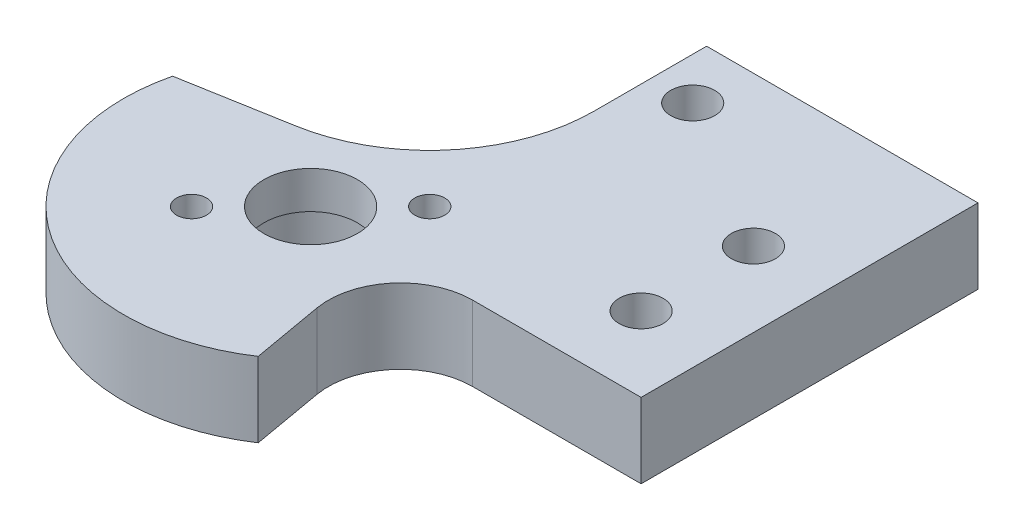
ISO-10303-21;
HEADER;
FILE_DESCRIPTION(('STEP AP214'),'2;1');
FILE_NAME('part.step','',(''),(''),'','','');
FILE_SCHEMA(('AUTOMOTIVE_DESIGN { 1 0 10303 214 1 1 1 1 }'));
ENDSEC;
DATA;
#1=APPLICATION_CONTEXT('core data for automotive mechanical design processes');
#2=APPLICATION_PROTOCOL_DEFINITION('international standard','automotive_design',2000,#1);
#3=PRODUCT_CONTEXT('',#1,'mechanical');
#4=PRODUCT('Part','Part','',(#3));
#5=PRODUCT_RELATED_PRODUCT_CATEGORY('part','',(#4));
#6=PRODUCT_DEFINITION_FORMATION('','',#4);
#7=PRODUCT_DEFINITION_CONTEXT('part definition',#1,'design');
#8=PRODUCT_DEFINITION('design','',#6,#7);
#9=PRODUCT_DEFINITION_SHAPE('','',#8);
#10=(LENGTH_UNIT() NAMED_UNIT(*) SI_UNIT(.MILLI.,.METRE.));
#11=(NAMED_UNIT(*) PLANE_ANGLE_UNIT() SI_UNIT($,.RADIAN.));
#12=(NAMED_UNIT(*) SI_UNIT($,.STERADIAN.) SOLID_ANGLE_UNIT());
#13=UNCERTAINTY_MEASURE_WITH_UNIT(LENGTH_MEASURE(1.E-05),#10,'distance_accuracy_value','');
#14=(GEOMETRIC_REPRESENTATION_CONTEXT(3) GLOBAL_UNCERTAINTY_ASSIGNED_CONTEXT((#13)) GLOBAL_UNIT_ASSIGNED_CONTEXT((#10,
#11,#12)) REPRESENTATION_CONTEXT('',''));
#15=CARTESIAN_POINT('',(0.,0.,0.));
#16=DIRECTION('',(0.,0.,1.));
#17=DIRECTION('',(1.,0.,0.));
#18=AXIS2_PLACEMENT_3D('',#15,#16,#17);
#19=CARTESIAN_POINT('',(-17.6568542494922,4.,17.9999999999997));
#20=DIRECTION('',(0.,-1.,0.));
#21=DIRECTION('',(0.,0.,-1.));
#22=AXIS2_PLACEMENT_3D('',#19,#20,#21);
#23=CYLINDRICAL_SURFACE('',#22,2.5);
#24=CARTESIAN_POINT('',(-17.6568542494922,4.,17.9999999999997));
#25=DIRECTION('',(0.,-1.,0.));
#26=DIRECTION('',(0.,0.,1.));
#27=AXIS2_PLACEMENT_3D('',#24,#25,#26);
#28=CIRCLE('',#27,2.5);
#29=CARTESIAN_POINT('',(-17.6568542494922,4.,20.4999999999997));
#30=VERTEX_POINT('',#29);
#31=EDGE_CURVE('E234',#30,#30,#28,.T.);
#32=ORIENTED_EDGE('',*,*,#31,.F.);
#33=EDGE_LOOP('',(#32));
#34=FACE_BOUND('',#33,.T.);
#35=CARTESIAN_POINT('',(-17.6568542494922,2.,17.9999999999997));
#36=DIRECTION('',(0.,-1.,0.));
#37=DIRECTION('',(0.,0.,-1.));
#38=AXIS2_PLACEMENT_3D('',#35,#36,#37);
#39=CIRCLE('',#38,2.5);
#40=CARTESIAN_POINT('',(-17.6568542494922,2.,15.4999999999997));
#41=VERTEX_POINT('',#40);
#42=EDGE_CURVE('E43',#41,#41,#39,.T.);
#43=ORIENTED_EDGE('',*,*,#42,.T.);
#44=EDGE_LOOP('',(#43));
#45=FACE_BOUND('',#44,.T.);
#46=ADVANCED_FACE('F39',(#34,#45),#23,.F.);
#47=CARTESIAN_POINT('',(-14.4748737341528,4.,14.8180194846603));
#48=DIRECTION('',(0.,1.,0.));
#49=DIRECTION('',(0.,0.,1.));
#50=AXIS2_PLACEMENT_3D('',#47,#48,#49);
#51=CYLINDRICAL_SURFACE('',#50,0.799999999999999);
#52=CARTESIAN_POINT('',(-14.4748737341528,4.,14.8180194846603));
#53=DIRECTION('',(0.,-1.,0.));
#54=DIRECTION('',(0.,0.,1.));
#55=AXIS2_PLACEMENT_3D('',#52,#53,#54);
#56=CIRCLE('',#55,0.799999999999999);
#57=CARTESIAN_POINT('',(-14.4748737341528,4.,15.6180194846603));
#58=VERTEX_POINT('',#57);
#59=EDGE_CURVE('E233',#58,#58,#56,.T.);
#60=ORIENTED_EDGE('',*,*,#59,.F.);
#61=EDGE_LOOP('',(#60));
#62=FACE_BOUND('',#61,.T.);
#63=CARTESIAN_POINT('',(-14.4748737341528,1.,14.8180194846603));
#64=DIRECTION('',(0.,-1.,0.));
#65=DIRECTION('',(0.,0.,-1.));
#66=AXIS2_PLACEMENT_3D('',#63,#64,#65);
#67=CIRCLE('',#66,0.799999999999999);
#68=CARTESIAN_POINT('',(-14.4748737341528,1.,14.0180194846603));
#69=VERTEX_POINT('',#68);
#70=EDGE_CURVE('E200',#69,#69,#67,.F.);
#71=ORIENTED_EDGE('',*,*,#70,.F.);
#72=EDGE_LOOP('',(#71));
#73=FACE_BOUND('',#72,.T.);
#74=ADVANCED_FACE('F296',(#62,#73),#51,.F.);
#75=CARTESIAN_POINT('',(-20.8388347648317,4.,21.1819805153392));
#76=DIRECTION('',(0.,1.,0.));
#77=DIRECTION('',(0.,0.,1.));
#78=AXIS2_PLACEMENT_3D('',#75,#76,#77);
#79=CYLINDRICAL_SURFACE('',#78,0.799999999999999);
#80=CARTESIAN_POINT('',(-20.8388347648317,4.,21.1819805153392));
#81=DIRECTION('',(0.,-1.,0.));
#82=DIRECTION('',(0.,0.,1.));
#83=AXIS2_PLACEMENT_3D('',#80,#81,#82);
#84=CIRCLE('',#83,0.799999999999999);
#85=CARTESIAN_POINT('',(-20.8388347648317,4.,21.9819805153392));
#86=VERTEX_POINT('',#85);
#87=EDGE_CURVE('E205',#86,#86,#84,.T.);
#88=ORIENTED_EDGE('',*,*,#87,.F.);
#89=EDGE_LOOP('',(#88));
#90=FACE_BOUND('',#89,.T.);
#91=CARTESIAN_POINT('',(-20.8388347648317,1.,21.1819805153392));
#92=DIRECTION('',(0.,-1.,0.));
#93=DIRECTION('',(0.,0.,-1.));
#94=AXIS2_PLACEMENT_3D('',#91,#92,#93);
#95=CIRCLE('',#94,0.799999999999999);
#96=CARTESIAN_POINT('',(-20.8388347648317,1.,20.3819805153392));
#97=VERTEX_POINT('',#96);
#98=EDGE_CURVE('E192',#97,#97,#95,.F.);
#99=ORIENTED_EDGE('',*,*,#98,.F.);
#100=EDGE_LOOP('',(#99));
#101=FACE_BOUND('',#100,.T.);
#102=ADVANCED_FACE('F306',(#90,#101),#79,.F.);
#103=CARTESIAN_POINT('',(-8.99999999999987,4.,21.8557868258206));
#104=DIRECTION('',(0.,-1.,0.));
#105=DIRECTION('',(0.,0.,-1.));
#106=AXIS2_PLACEMENT_3D('',#103,#104,#105);
#107=PLANE('',#106);
#108=ORIENTED_EDGE('',*,*,#87,.T.);
#109=EDGE_LOOP('',(#108));
#110=FACE_BOUND('',#109,.T.);
#111=ORIENTED_EDGE('',*,*,#59,.T.);
#112=EDGE_LOOP('',(#111));
#113=FACE_BOUND('',#112,.T.);
#114=DIRECTION('',(0.,0.,1.));
#115=VECTOR('',#114,1.);
#116=CARTESIAN_POINT('',(0.,4.,0.));
#117=LINE('',#116,#115);
#118=CARTESIAN_POINT('',(0.,4.,0.));
#119=VERTEX_POINT('',#118);
#120=CARTESIAN_POINT('',(0.,4.,17.9999999999998));
#121=VERTEX_POINT('',#120);
#122=EDGE_CURVE('E185',#119,#121,#117,.T.);
#123=ORIENTED_EDGE('',*,*,#122,.F.);
#124=DIRECTION('',(1.,0.,0.));
#125=VECTOR('',#124,1.);
#126=CARTESIAN_POINT('',(0.,4.,0.));
#127=LINE('',#126,#125);
#128=CARTESIAN_POINT('',(-14.5000000000014,4.,0.));
#129=VERTEX_POINT('',#128);
#130=EDGE_CURVE('E155',#129,#119,#127,.T.);
#131=ORIENTED_EDGE('',*,*,#130,.F.);
#132=DIRECTION('',(0.,0.,-1.));
#133=VECTOR('',#132,1.);
#134=CARTESIAN_POINT('',(-14.5000000000014,4.,0.));
#135=LINE('',#134,#133);
#136=CARTESIAN_POINT('',(-14.5000000000014,4.,6.00000000000005));
#137=VERTEX_POINT('',#136);
#138=EDGE_CURVE('E131',#137,#129,#135,.T.);
#139=ORIENTED_EDGE('',*,*,#138,.F.);
#140=CARTESIAN_POINT('',(-23.2971138346847,4.,6.00000000000005));
#141=DIRECTION('',(0.,1.,0.));
#142=DIRECTION('',(0.,0.,-1.));
#143=AXIS2_PLACEMENT_3D('',#140,#141,#142);
#144=CIRCLE('',#143,8.79711383468331);
#145=CARTESIAN_POINT('',(-21.7695110485634,4.,14.6634659085271));
#146=VERTEX_POINT('',#145);
#147=EDGE_CURVE('E141',#146,#137,#144,.T.);
#148=ORIENTED_EDGE('',*,*,#147,.F.);
#149=DIRECTION('',(0.984807753012208,0.,-0.17364817766693));
#150=VECTOR('',#149,1.);
#151=CARTESIAN_POINT('',(-21.7695110485634,4.,14.6634659085271));
#152=LINE('',#151,#150);
#153=CARTESIAN_POINT('',(-27.3773591064756,4.,15.6522808248506));
#154=VERTEX_POINT('',#153);
#155=EDGE_CURVE('E150',#154,#146,#152,.T.);
#156=ORIENTED_EDGE('',*,*,#155,.F.);
#157=CARTESIAN_POINT('',(-17.6568542494922,4.,17.9999999999997));
#158=DIRECTION('',(0.,-1.,0.));
#159=DIRECTION('',(0.,0.,1.));
#160=AXIS2_PLACEMENT_3D('',#157,#158,#159);
#161=CIRCLE('',#160,10.);
#162=CARTESIAN_POINT('',(-12.1261114005437,4.,26.3313194356476));
#163=VERTEX_POINT('',#162);
#164=EDGE_CURVE('E265',#163,#154,#161,.T.);
#165=ORIENTED_EDGE('',*,*,#164,.F.);
#166=DIRECTION('',(0.173648177666935,0.,0.984807753012207));
#167=VECTOR('',#166,1.);
#168=CARTESIAN_POINT('',(-12.7972087600305,4.,22.5253371815966));
#169=LINE('',#168,#167);
#170=CARTESIAN_POINT('',(-12.7972087600305,4.,22.5253371815966));
#171=VERTEX_POINT('',#170);
#172=EDGE_CURVE('E257',#171,#163,#169,.T.);
#173=ORIENTED_EDGE('',*,*,#172,.F.);
#174=CARTESIAN_POINT('',(-8.99999999999987,4.,21.8557868258206));
#175=DIRECTION('',(0.,1.,0.));
#176=DIRECTION('',(0.,0.,-1.));
#177=AXIS2_PLACEMENT_3D('',#174,#175,#176);
#178=CIRCLE('',#177,3.85578682582079);
#179=CARTESIAN_POINT('',(-8.99999999999987,4.,17.9999999999998));
#180=VERTEX_POINT('',#179);
#181=EDGE_CURVE('E256',#180,#171,#178,.T.);
#182=ORIENTED_EDGE('',*,*,#181,.F.);
#183=DIRECTION('',(-1.,0.,0.));
#184=VECTOR('',#183,1.);
#185=CARTESIAN_POINT('',(0.,4.,17.9999999999998));
#186=LINE('',#185,#184);
#187=EDGE_CURVE('E253',#121,#180,#186,.T.);
#188=ORIENTED_EDGE('',*,*,#187,.F.);
#189=EDGE_LOOP('',(#123,#131,#139,#148,#156,#165,#173,#182,#188));
#190=FACE_BOUND('',#189,.T.);
#191=CARTESIAN_POINT('',(-4.,4.,13.9999999999999));
#192=DIRECTION('',(0.,-1.,0.));
#193=DIRECTION('',(0.,0.,1.));
#194=AXIS2_PLACEMENT_3D('',#191,#192,#193);
#195=CIRCLE('',#194,1.17499999999999);
#196=CARTESIAN_POINT('',(-4.,4.,15.1749999999999));
#197=VERTEX_POINT('',#196);
#198=EDGE_CURVE('E162',#197,#197,#195,.T.);
#199=ORIENTED_EDGE('',*,*,#198,.T.);
#200=EDGE_LOOP('',(#199));
#201=FACE_BOUND('',#200,.T.);
#202=CARTESIAN_POINT('',(-4.,4.,7.9999999999999));
#203=DIRECTION('',(0.,-1.,0.));
#204=DIRECTION('',(0.,0.,1.));
#205=AXIS2_PLACEMENT_3D('',#202,#203,#204);
#206=CIRCLE('',#205,1.17499999999999);
#207=CARTESIAN_POINT('',(-4.,4.,9.17499999999989));
#208=VERTEX_POINT('',#207);
#209=EDGE_CURVE('E242',#208,#208,#206,.T.);
#210=ORIENTED_EDGE('',*,*,#209,.T.);
#211=EDGE_LOOP('',(#210));
#212=FACE_BOUND('',#211,.T.);
#213=CARTESIAN_POINT('',(-12.2426406871194,4.,3.00000000000002));
#214=DIRECTION('',(0.,-1.,0.));
#215=DIRECTION('',(0.,0.,1.));
#216=AXIS2_PLACEMENT_3D('',#213,#214,#215);
#217=CIRCLE('',#216,1.17499999999999);
#218=CARTESIAN_POINT('',(-12.2426406871194,4.,4.17500000000001));
#219=VERTEX_POINT('',#218);
#220=EDGE_CURVE('E238',#219,#219,#217,.T.);
#221=ORIENTED_EDGE('',*,*,#220,.T.);
#222=EDGE_LOOP('',(#221));
#223=FACE_BOUND('',#222,.T.);
#224=ORIENTED_EDGE('',*,*,#31,.T.);
#225=EDGE_LOOP('',(#224));
#226=FACE_BOUND('',#225,.T.);
#227=ADVANCED_FACE('F154',(#110,#113,#190,#201,#212,#223,#226),#107,.F.);
#228=CARTESIAN_POINT('',(-8.99999999999987,0.,21.8557868258206));
#229=DIRECTION('',(0.,-1.,0.));
#230=DIRECTION('',(0.,0.,-1.));
#231=AXIS2_PLACEMENT_3D('',#228,#229,#230);
#232=PLANE('',#231);
#233=CARTESIAN_POINT('',(-17.6568542494922,0.,17.9999999999997));
#234=DIRECTION('',(0.,-1.,0.));
#235=DIRECTION('',(0.,0.,-1.));
#236=AXIS2_PLACEMENT_3D('',#233,#234,#235);
#237=CIRCLE('',#236,3.05);
#238=CARTESIAN_POINT('',(-15.1440139258115,0.,16.2713781478632));
#239=VERTEX_POINT('',#238);
#240=CARTESIAN_POINT('',(-19.3854761016288,0.,20.5128403236805));
#241=VERTEX_POINT('',#240);
#242=EDGE_CURVE('E327',#239,#241,#237,.T.);
#243=ORIENTED_EDGE('',*,*,#242,.F.);
#244=CARTESIAN_POINT('',(-14.4748737341528,0.,14.8180194846603));
#245=DIRECTION('',(0.,-1.,0.));
#246=DIRECTION('',(0.,0.,-1.));
#247=AXIS2_PLACEMENT_3D('',#244,#245,#246);
#248=CIRCLE('',#247,1.6);
#249=CARTESIAN_POINT('',(-15.9282323973557,0.,15.487159676319));
#250=VERTEX_POINT('',#249);
#251=EDGE_CURVE('E214',#250,#239,#248,.T.);
#252=ORIENTED_EDGE('',*,*,#251,.F.);
#253=CARTESIAN_POINT('',(-20.169694573173,0.,19.7286218521363));
#254=VERTEX_POINT('',#253);
#255=EDGE_CURVE('E345',#254,#250,#237,.T.);
#256=ORIENTED_EDGE('',*,*,#255,.F.);
#257=CARTESIAN_POINT('',(-20.8388347648317,0.,21.1819805153392));
#258=DIRECTION('',(0.,-1.,0.));
#259=DIRECTION('',(0.,0.,-1.));
#260=AXIS2_PLACEMENT_3D('',#257,#258,#259);
#261=CIRCLE('',#260,1.6);
#262=EDGE_CURVE('E228',#241,#254,#261,.T.);
#263=ORIENTED_EDGE('',*,*,#262,.F.);
#264=EDGE_LOOP('',(#243,#252,#256,#263));
#265=FACE_BOUND('',#264,.T.);
#266=CARTESIAN_POINT('',(-12.2426406871194,0.,3.00000000000002));
#267=DIRECTION('',(0.,-1.,0.));
#268=DIRECTION('',(0.,0.,1.));
#269=AXIS2_PLACEMENT_3D('',#266,#267,#268);
#270=CIRCLE('',#269,1.17499999999999);
#271=CARTESIAN_POINT('',(-12.2426406871194,0.,4.17500000000001));
#272=VERTEX_POINT('',#271);
#273=EDGE_CURVE('E240',#272,#272,#270,.T.);
#274=ORIENTED_EDGE('',*,*,#273,.F.);
#275=EDGE_LOOP('',(#274));
#276=FACE_BOUND('',#275,.T.);
#277=CARTESIAN_POINT('',(-4.,0.,13.9999999999999));
#278=DIRECTION('',(0.,-1.,0.));
#279=DIRECTION('',(0.,0.,1.));
#280=AXIS2_PLACEMENT_3D('',#277,#278,#279);
#281=CIRCLE('',#280,1.17499999999999);
#282=CARTESIAN_POINT('',(-4.,0.,15.1749999999999));
#283=VERTEX_POINT('',#282);
#284=EDGE_CURVE('E250',#283,#283,#281,.T.);
#285=ORIENTED_EDGE('',*,*,#284,.F.);
#286=EDGE_LOOP('',(#285));
#287=FACE_BOUND('',#286,.T.);
#288=DIRECTION('',(0.,0.,1.));
#289=VECTOR('',#288,1.);
#290=CARTESIAN_POINT('',(0.,0.,0.));
#291=LINE('',#290,#289);
#292=CARTESIAN_POINT('',(0.,0.,0.));
#293=VERTEX_POINT('',#292);
#294=CARTESIAN_POINT('',(0.,0.,17.9999999999998));
#295=VERTEX_POINT('',#294);
#296=EDGE_CURVE('E157',#293,#295,#291,.T.);
#297=ORIENTED_EDGE('',*,*,#296,.T.);
#298=DIRECTION('',(-1.,0.,0.));
#299=VECTOR('',#298,1.);
#300=CARTESIAN_POINT('',(0.,0.,17.9999999999998));
#301=LINE('',#300,#299);
#302=CARTESIAN_POINT('',(-8.99999999999987,0.,17.9999999999998));
#303=VERTEX_POINT('',#302);
#304=EDGE_CURVE('E163',#295,#303,#301,.T.);
#305=ORIENTED_EDGE('',*,*,#304,.T.);
#306=CARTESIAN_POINT('',(-8.99999999999987,0.,21.8557868258206));
#307=DIRECTION('',(0.,1.,0.));
#308=DIRECTION('',(0.,0.,-1.));
#309=AXIS2_PLACEMENT_3D('',#306,#307,#308);
#310=CIRCLE('',#309,3.85578682582079);
#311=CARTESIAN_POINT('',(-12.7972087600305,0.,22.5253371815966));
#312=VERTEX_POINT('',#311);
#313=EDGE_CURVE('E164',#303,#312,#310,.T.);
#314=ORIENTED_EDGE('',*,*,#313,.T.);
#315=DIRECTION('',(0.173648177666935,0.,0.984807753012207));
#316=VECTOR('',#315,1.);
#317=CARTESIAN_POINT('',(-12.7972087600305,0.,22.5253371815966));
#318=LINE('',#317,#316);
#319=CARTESIAN_POINT('',(-12.1261114005437,0.,26.3313194356476));
#320=VERTEX_POINT('',#319);
#321=EDGE_CURVE('E166',#312,#320,#318,.T.);
#322=ORIENTED_EDGE('',*,*,#321,.T.);
#323=CARTESIAN_POINT('',(-17.6568542494922,0.,17.9999999999997));
#324=DIRECTION('',(0.,-1.,0.));
#325=DIRECTION('',(0.,0.,1.));
#326=AXIS2_PLACEMENT_3D('',#323,#324,#325);
#327=CIRCLE('',#326,10.);
#328=CARTESIAN_POINT('',(-27.3773591064756,0.,15.6522808248506));
#329=VERTEX_POINT('',#328);
#330=EDGE_CURVE('E171',#320,#329,#327,.T.);
#331=ORIENTED_EDGE('',*,*,#330,.T.);
#332=DIRECTION('',(0.984807753012208,0.,-0.17364817766693));
#333=VECTOR('',#332,1.);
#334=CARTESIAN_POINT('',(-21.7695110485634,0.,14.6634659085271));
#335=LINE('',#334,#333);
#336=CARTESIAN_POINT('',(-21.7695110485634,0.,14.6634659085271));
#337=VERTEX_POINT('',#336);
#338=EDGE_CURVE('E172',#329,#337,#335,.T.);
#339=ORIENTED_EDGE('',*,*,#338,.T.);
#340=CARTESIAN_POINT('',(-23.2971138346847,0.,6.00000000000005));
#341=DIRECTION('',(0.,1.,0.));
#342=DIRECTION('',(0.,0.,-1.));
#343=AXIS2_PLACEMENT_3D('',#340,#341,#342);
#344=CIRCLE('',#343,8.79711383468331);
#345=CARTESIAN_POINT('',(-14.5000000000014,0.,6.00000000000005));
#346=VERTEX_POINT('',#345);
#347=EDGE_CURVE('E180',#337,#346,#344,.T.);
#348=ORIENTED_EDGE('',*,*,#347,.T.);
#349=DIRECTION('',(0.,0.,-1.));
#350=VECTOR('',#349,1.);
#351=CARTESIAN_POINT('',(-14.5000000000014,0.,0.));
#352=LINE('',#351,#350);
#353=CARTESIAN_POINT('',(-14.5000000000014,0.,0.));
#354=VERTEX_POINT('',#353);
#355=EDGE_CURVE('E132',#346,#354,#352,.T.);
#356=ORIENTED_EDGE('',*,*,#355,.T.);
#357=DIRECTION('',(1.,0.,0.));
#358=VECTOR('',#357,1.);
#359=CARTESIAN_POINT('',(0.,0.,0.));
#360=LINE('',#359,#358);
#361=EDGE_CURVE('E179',#354,#293,#360,.T.);
#362=ORIENTED_EDGE('',*,*,#361,.T.);
#363=EDGE_LOOP('',(#297,#305,#314,#322,#331,#339,#348,#356,#362));
#364=FACE_BOUND('',#363,.T.);
#365=CARTESIAN_POINT('',(-4.,0.,7.9999999999999));
#366=DIRECTION('',(0.,-1.,0.));
#367=DIRECTION('',(0.,0.,1.));
#368=AXIS2_PLACEMENT_3D('',#365,#366,#367);
#369=CIRCLE('',#368,1.17499999999999);
#370=CARTESIAN_POINT('',(-4.,0.,9.17499999999989));
#371=VERTEX_POINT('',#370);
#372=EDGE_CURVE('E241',#371,#371,#369,.T.);
#373=ORIENTED_EDGE('',*,*,#372,.F.);
#374=EDGE_LOOP('',(#373));
#375=FACE_BOUND('',#374,.T.);
#376=ADVANCED_FACE('F281',(#265,#276,#287,#364,#375),#232,.T.);
#377=CARTESIAN_POINT('',(0.,4.,0.));
#378=DIRECTION('',(-1.,0.,0.));
#379=DIRECTION('',(0.,0.,-1.));
#380=AXIS2_PLACEMENT_3D('',#377,#378,#379);
#381=PLANE('',#380);
#382=ORIENTED_EDGE('',*,*,#296,.F.);
#383=DIRECTION('',(0.,-1.,0.));
#384=VECTOR('',#383,1.);
#385=CARTESIAN_POINT('',(0.,4.,0.));
#386=LINE('',#385,#384);
#387=EDGE_CURVE('E63',#119,#293,#386,.T.);
#388=ORIENTED_EDGE('',*,*,#387,.F.);
#389=ORIENTED_EDGE('',*,*,#122,.T.);
#390=DIRECTION('',(0.,-1.,0.));
#391=VECTOR('',#390,1.);
#392=CARTESIAN_POINT('',(0.,4.,17.9999999999998));
#393=LINE('',#392,#391);
#394=EDGE_CURVE('E106',#121,#295,#393,.T.);
#395=ORIENTED_EDGE('',*,*,#394,.T.);
#396=EDGE_LOOP('',(#382,#388,#389,#395));
#397=FACE_BOUND('',#396,.T.);
#398=ADVANCED_FACE('F41',(#397),#381,.F.);
#399=CARTESIAN_POINT('',(0.,4.,17.9999999999998));
#400=DIRECTION('',(0.,0.,-1.));
#401=DIRECTION('',(1.,0.,0.));
#402=AXIS2_PLACEMENT_3D('',#399,#400,#401);
#403=PLANE('',#402);
#404=ORIENTED_EDGE('',*,*,#304,.F.);
#405=ORIENTED_EDGE('',*,*,#394,.F.);
#406=ORIENTED_EDGE('',*,*,#187,.T.);
#407=DIRECTION('',(0.,-1.,0.));
#408=VECTOR('',#407,1.);
#409=CARTESIAN_POINT('',(-8.99999999999987,4.,17.9999999999998));
#410=LINE('',#409,#408);
#411=EDGE_CURVE('E191',#180,#303,#410,.T.);
#412=ORIENTED_EDGE('',*,*,#411,.T.);
#413=EDGE_LOOP('',(#404,#405,#406,#412));
#414=FACE_BOUND('',#413,.T.);
#415=ADVANCED_FACE('F277',(#414),#403,.F.);
#416=CARTESIAN_POINT('',(-8.99999999999987,4.,21.8557868258206));
#417=DIRECTION('',(0.,-1.,0.));
#418=DIRECTION('',(0.,0.,-1.));
#419=AXIS2_PLACEMENT_3D('',#416,#417,#418);
#420=CYLINDRICAL_SURFACE('',#419,3.85578682582079);
#421=ORIENTED_EDGE('',*,*,#313,.F.);
#422=ORIENTED_EDGE('',*,*,#411,.F.);
#423=ORIENTED_EDGE('',*,*,#181,.T.);
#424=DIRECTION('',(0.,-1.,0.));
#425=VECTOR('',#424,1.);
#426=CARTESIAN_POINT('',(-12.7972087600305,4.,22.5253371815966));
#427=LINE('',#426,#425);
#428=EDGE_CURVE('E188',#171,#312,#427,.T.);
#429=ORIENTED_EDGE('',*,*,#428,.T.);
#430=EDGE_LOOP('',(#421,#422,#423,#429));
#431=FACE_BOUND('',#430,.T.);
#432=ADVANCED_FACE('F278',(#431),#420,.F.);
#433=CARTESIAN_POINT('',(-12.7972087600305,4.,22.5253371815966));
#434=DIRECTION('',(-0.984807753012207,0.,0.173648177666935));
#435=DIRECTION('',(-0.173648177666935,0.,-0.984807753012207));
#436=AXIS2_PLACEMENT_3D('',#433,#434,#435);
#437=PLANE('',#436);
#438=ORIENTED_EDGE('',*,*,#321,.F.);
#439=ORIENTED_EDGE('',*,*,#428,.F.);
#440=ORIENTED_EDGE('',*,*,#172,.T.);
#441=DIRECTION('',(0.,-1.,0.));
#442=VECTOR('',#441,1.);
#443=CARTESIAN_POINT('',(-12.1261114005437,4.,26.3313194356476));
#444=LINE('',#443,#442);
#445=EDGE_CURVE('E189',#163,#320,#444,.T.);
#446=ORIENTED_EDGE('',*,*,#445,.T.);
#447=EDGE_LOOP('',(#438,#439,#440,#446));
#448=FACE_BOUND('',#447,.T.);
#449=ADVANCED_FACE('F279',(#448),#437,.F.);
#450=CARTESIAN_POINT('',(-17.6568542494922,4.,17.9999999999997));
#451=DIRECTION('',(0.,-1.,0.));
#452=DIRECTION('',(0.,0.,-1.));
#453=AXIS2_PLACEMENT_3D('',#450,#451,#452);
#454=CYLINDRICAL_SURFACE('',#453,10.);
#455=ORIENTED_EDGE('',*,*,#330,.F.);
#456=ORIENTED_EDGE('',*,*,#445,.F.);
#457=ORIENTED_EDGE('',*,*,#164,.T.);
#458=DIRECTION('',(0.,-1.,0.));
#459=VECTOR('',#458,1.);
#460=CARTESIAN_POINT('',(-27.3773591064756,4.,15.6522808248506));
#461=LINE('',#460,#459);
#462=EDGE_CURVE('E187',#154,#329,#461,.T.);
#463=ORIENTED_EDGE('',*,*,#462,.T.);
#464=EDGE_LOOP('',(#455,#456,#457,#463));
#465=FACE_BOUND('',#464,.T.);
#466=ADVANCED_FACE('F271',(#465),#454,.T.);
#467=CARTESIAN_POINT('',(-21.7695110485634,4.,14.6634659085271));
#468=DIRECTION('',(0.17364817766693,0.,0.984807753012208));
#469=DIRECTION('',(-0.984807753012208,0.,0.17364817766693));
#470=AXIS2_PLACEMENT_3D('',#467,#468,#469);
#471=PLANE('',#470);
#472=ORIENTED_EDGE('',*,*,#338,.F.);
#473=ORIENTED_EDGE('',*,*,#462,.F.);
#474=ORIENTED_EDGE('',*,*,#155,.T.);
#475=DIRECTION('',(0.,-1.,0.));
#476=VECTOR('',#475,1.);
#477=CARTESIAN_POINT('',(-21.7695110485634,4.,14.6634659085271));
#478=LINE('',#477,#476);
#479=EDGE_CURVE('E138',#146,#337,#478,.T.);
#480=ORIENTED_EDGE('',*,*,#479,.T.);
#481=EDGE_LOOP('',(#472,#473,#474,#480));
#482=FACE_BOUND('',#481,.T.);
#483=ADVANCED_FACE('F270',(#482),#471,.F.);
#484=CARTESIAN_POINT('',(-23.2971138346847,4.,6.00000000000005));
#485=DIRECTION('',(0.,-1.,0.));
#486=DIRECTION('',(0.,0.,-1.));
#487=AXIS2_PLACEMENT_3D('',#484,#485,#486);
#488=CYLINDRICAL_SURFACE('',#487,8.79711383468331);
#489=ORIENTED_EDGE('',*,*,#347,.F.);
#490=ORIENTED_EDGE('',*,*,#479,.F.);
#491=ORIENTED_EDGE('',*,*,#147,.T.);
#492=DIRECTION('',(0.,-1.,0.));
#493=VECTOR('',#492,1.);
#494=CARTESIAN_POINT('',(-14.5000000000014,4.,6.00000000000005));
#495=LINE('',#494,#493);
#496=EDGE_CURVE('E130',#137,#346,#495,.T.);
#497=ORIENTED_EDGE('',*,*,#496,.T.);
#498=EDGE_LOOP('',(#489,#490,#491,#497));
#499=FACE_BOUND('',#498,.T.);
#500=ADVANCED_FACE('F144',(#499),#488,.F.);
#501=CARTESIAN_POINT('',(-14.5000000000014,4.,0.));
#502=DIRECTION('',(1.,0.,0.));
#503=DIRECTION('',(0.,0.,1.));
#504=AXIS2_PLACEMENT_3D('',#501,#502,#503);
#505=PLANE('',#504);
#506=ORIENTED_EDGE('',*,*,#355,.F.);
#507=ORIENTED_EDGE('',*,*,#496,.F.);
#508=ORIENTED_EDGE('',*,*,#138,.T.);
#509=DIRECTION('',(0.,-1.,0.));
#510=VECTOR('',#509,1.);
#511=CARTESIAN_POINT('',(-14.5000000000014,4.,0.));
#512=LINE('',#511,#510);
#513=EDGE_CURVE('E139',#129,#354,#512,.T.);
#514=ORIENTED_EDGE('',*,*,#513,.T.);
#515=EDGE_LOOP('',(#506,#507,#508,#514));
#516=FACE_BOUND('',#515,.T.);
#517=ADVANCED_FACE('F127',(#516),#505,.F.);
#518=CARTESIAN_POINT('',(0.,4.,0.));
#519=DIRECTION('',(0.,0.,1.));
#520=DIRECTION('',(-1.,0.,0.));
#521=AXIS2_PLACEMENT_3D('',#518,#519,#520);
#522=PLANE('',#521);
#523=ORIENTED_EDGE('',*,*,#361,.F.);
#524=ORIENTED_EDGE('',*,*,#513,.F.);
#525=ORIENTED_EDGE('',*,*,#130,.T.);
#526=ORIENTED_EDGE('',*,*,#387,.T.);
#527=EDGE_LOOP('',(#523,#524,#525,#526));
#528=FACE_BOUND('',#527,.T.);
#529=ADVANCED_FACE('F283',(#528),#522,.F.);
#530=CARTESIAN_POINT('',(-4.,4.,13.9999999999999));
#531=DIRECTION('',(0.,-1.,0.));
#532=DIRECTION('',(0.,0.,-1.));
#533=AXIS2_PLACEMENT_3D('',#530,#531,#532);
#534=CYLINDRICAL_SURFACE('',#533,1.17499999999999);
#535=ORIENTED_EDGE('',*,*,#198,.F.);
#536=EDGE_LOOP('',(#535));
#537=FACE_BOUND('',#536,.T.);
#538=ORIENTED_EDGE('',*,*,#284,.T.);
#539=EDGE_LOOP('',(#538));
#540=FACE_BOUND('',#539,.T.);
#541=ADVANCED_FACE('F286',(#537,#540),#534,.F.);
#542=CARTESIAN_POINT('',(-4.,4.,7.9999999999999));
#543=DIRECTION('',(0.,-1.,0.));
#544=DIRECTION('',(0.,0.,-1.));
#545=AXIS2_PLACEMENT_3D('',#542,#543,#544);
#546=CYLINDRICAL_SURFACE('',#545,1.17499999999999);
#547=ORIENTED_EDGE('',*,*,#209,.F.);
#548=EDGE_LOOP('',(#547));
#549=FACE_BOUND('',#548,.T.);
#550=ORIENTED_EDGE('',*,*,#372,.T.);
#551=EDGE_LOOP('',(#550));
#552=FACE_BOUND('',#551,.T.);
#553=ADVANCED_FACE('F292',(#549,#552),#546,.F.);
#554=CARTESIAN_POINT('',(-12.2426406871194,4.,3.00000000000002));
#555=DIRECTION('',(0.,-1.,0.));
#556=DIRECTION('',(0.,0.,-1.));
#557=AXIS2_PLACEMENT_3D('',#554,#555,#556);
#558=CYLINDRICAL_SURFACE('',#557,1.17499999999999);
#559=ORIENTED_EDGE('',*,*,#220,.F.);
#560=EDGE_LOOP('',(#559));
#561=FACE_BOUND('',#560,.T.);
#562=ORIENTED_EDGE('',*,*,#273,.T.);
#563=EDGE_LOOP('',(#562));
#564=FACE_BOUND('',#563,.T.);
#565=ADVANCED_FACE('F312',(#561,#564),#558,.F.);
#566=CARTESIAN_POINT('',(-20.8388347648317,1.,21.1819805153392));
#567=DIRECTION('',(0.,-1.,0.));
#568=DIRECTION('',(0.,0.,-1.));
#569=AXIS2_PLACEMENT_3D('',#566,#567,#568);
#570=PLANE('',#569);
#571=CARTESIAN_POINT('',(-17.6568542494922,1.,17.9999999999997));
#572=DIRECTION('',(0.,-1.,0.));
#573=DIRECTION('',(0.,0.,-1.));
#574=AXIS2_PLACEMENT_3D('',#571,#572,#573);
#575=CIRCLE('',#574,3.05);
#576=CARTESIAN_POINT('',(-19.3854761016288,1.,20.5128403236805));
#577=VERTEX_POINT('',#576);
#578=CARTESIAN_POINT('',(-20.169694573173,1.,19.7286218521363));
#579=VERTEX_POINT('',#578);
#580=EDGE_CURVE('E355',#577,#579,#575,.T.);
#581=ORIENTED_EDGE('',*,*,#580,.F.);
#582=CARTESIAN_POINT('',(-20.8388347648317,1.,21.1819805153392));
#583=DIRECTION('',(0.,-1.,0.));
#584=DIRECTION('',(0.,0.,-1.));
#585=AXIS2_PLACEMENT_3D('',#582,#583,#584);
#586=CIRCLE('',#585,1.6);
#587=EDGE_CURVE('E220',#577,#579,#586,.T.);
#588=ORIENTED_EDGE('',*,*,#587,.T.);
#589=EDGE_LOOP('',(#581,#588));
#590=FACE_BOUND('',#589,.T.);
#591=ORIENTED_EDGE('',*,*,#98,.T.);
#592=EDGE_LOOP('',(#591));
#593=FACE_BOUND('',#592,.T.);
#594=ADVANCED_FACE('F317',(#590,#593),#570,.T.);
#595=CARTESIAN_POINT('',(-20.8388347648317,1.,21.1819805153392));
#596=DIRECTION('',(0.,-1.,0.));
#597=DIRECTION('',(0.,0.,-1.));
#598=AXIS2_PLACEMENT_3D('',#595,#596,#597);
#599=CYLINDRICAL_SURFACE('',#598,1.6);
#600=ORIENTED_EDGE('',*,*,#587,.F.);
#601=DIRECTION('',(0.,-1.,0.));
#602=VECTOR('',#601,1.);
#603=CARTESIAN_POINT('',(-19.3854761016288,1.,20.5128403236805));
#604=LINE('',#603,#602);
#605=EDGE_CURVE('E221',#577,#241,#604,.T.);
#606=ORIENTED_EDGE('',*,*,#605,.T.);
#607=ORIENTED_EDGE('',*,*,#262,.T.);
#608=DIRECTION('',(0.,-1.,0.));
#609=VECTOR('',#608,1.);
#610=CARTESIAN_POINT('',(-20.169694573173,1.,19.7286218521363));
#611=LINE('',#610,#609);
#612=EDGE_CURVE('E347',#254,#579,#611,.F.);
#613=ORIENTED_EDGE('',*,*,#612,.T.);
#614=EDGE_LOOP('',(#600,#606,#607,#613));
#615=FACE_BOUND('',#614,.T.);
#616=ADVANCED_FACE('F380',(#615),#599,.F.);
#617=CARTESIAN_POINT('',(-14.4748737341528,1.,14.8180194846603));
#618=DIRECTION('',(0.,-1.,0.));
#619=DIRECTION('',(0.,0.,-1.));
#620=AXIS2_PLACEMENT_3D('',#617,#618,#619);
#621=PLANE('',#620);
#622=CARTESIAN_POINT('',(-17.6568542494922,1.,17.9999999999997));
#623=DIRECTION('',(0.,-1.,0.));
#624=DIRECTION('',(0.,0.,-1.));
#625=AXIS2_PLACEMENT_3D('',#622,#623,#624);
#626=CIRCLE('',#625,3.05);
#627=CARTESIAN_POINT('',(-15.9282323973557,1.,15.487159676319));
#628=VERTEX_POINT('',#627);
#629=CARTESIAN_POINT('',(-15.1440139258115,1.,16.2713781478632));
#630=VERTEX_POINT('',#629);
#631=EDGE_CURVE('E54',#628,#630,#626,.T.);
#632=ORIENTED_EDGE('',*,*,#631,.F.);
#633=CARTESIAN_POINT('',(-14.4748737341528,1.,14.8180194846603));
#634=DIRECTION('',(0.,-1.,0.));
#635=DIRECTION('',(0.,0.,-1.));
#636=AXIS2_PLACEMENT_3D('',#633,#634,#635);
#637=CIRCLE('',#636,1.6);
#638=EDGE_CURVE('E198',#628,#630,#637,.T.);
#639=ORIENTED_EDGE('',*,*,#638,.T.);
#640=EDGE_LOOP('',(#632,#639));
#641=FACE_BOUND('',#640,.T.);
#642=ORIENTED_EDGE('',*,*,#70,.T.);
#643=EDGE_LOOP('',(#642));
#644=FACE_BOUND('',#643,.T.);
#645=ADVANCED_FACE('F212',(#641,#644),#621,.T.);
#646=CARTESIAN_POINT('',(-14.4748737341528,1.,14.8180194846603));
#647=DIRECTION('',(0.,-1.,0.));
#648=DIRECTION('',(0.,0.,-1.));
#649=AXIS2_PLACEMENT_3D('',#646,#647,#648);
#650=CYLINDRICAL_SURFACE('',#649,1.6);
#651=ORIENTED_EDGE('',*,*,#638,.F.);
#652=DIRECTION('',(0.,-1.,0.));
#653=VECTOR('',#652,1.);
#654=CARTESIAN_POINT('',(-15.9282323973557,1.,15.487159676319));
#655=LINE('',#654,#653);
#656=EDGE_CURVE('E11',#628,#250,#655,.T.);
#657=ORIENTED_EDGE('',*,*,#656,.T.);
#658=ORIENTED_EDGE('',*,*,#251,.T.);
#659=DIRECTION('',(0.,-1.,0.));
#660=VECTOR('',#659,1.);
#661=CARTESIAN_POINT('',(-15.1440139258115,1.,16.2713781478632));
#662=LINE('',#661,#660);
#663=EDGE_CURVE('E48',#239,#630,#662,.F.);
#664=ORIENTED_EDGE('',*,*,#663,.T.);
#665=EDGE_LOOP('',(#651,#657,#658,#664));
#666=FACE_BOUND('',#665,.T.);
#667=ADVANCED_FACE('F210',(#666),#650,.F.);
#668=CARTESIAN_POINT('',(-17.6568542494922,2.,17.9999999999997));
#669=DIRECTION('',(0.,-1.,0.));
#670=DIRECTION('',(0.,0.,-1.));
#671=AXIS2_PLACEMENT_3D('',#668,#669,#670);
#672=CYLINDRICAL_SURFACE('',#671,3.05);
#673=CARTESIAN_POINT('',(-17.6568542494922,2.,17.9999999999997));
#674=DIRECTION('',(0.,-1.,0.));
#675=DIRECTION('',(0.,0.,-1.));
#676=AXIS2_PLACEMENT_3D('',#673,#674,#675);
#677=CIRCLE('',#676,3.05);
#678=CARTESIAN_POINT('',(-17.6568542494922,2.,14.9499999999997));
#679=VERTEX_POINT('',#678);
#680=EDGE_CURVE('E341',#679,#679,#677,.T.);
#681=ORIENTED_EDGE('',*,*,#680,.F.);
#682=EDGE_LOOP('',(#681));
#683=FACE_BOUND('',#682,.T.);
#684=ORIENTED_EDGE('',*,*,#580,.T.);
#685=ORIENTED_EDGE('',*,*,#612,.F.);
#686=ORIENTED_EDGE('',*,*,#255,.T.);
#687=ORIENTED_EDGE('',*,*,#656,.F.);
#688=ORIENTED_EDGE('',*,*,#631,.T.);
#689=ORIENTED_EDGE('',*,*,#663,.F.);
#690=ORIENTED_EDGE('',*,*,#242,.T.);
#691=ORIENTED_EDGE('',*,*,#605,.F.);
#692=EDGE_LOOP('',(#684,#685,#686,#687,#688,#689,#690,#691));
#693=FACE_BOUND('',#692,.T.);
#694=ADVANCED_FACE('F362',(#683,#693),#672,.F.);
#695=CARTESIAN_POINT('',(-17.6568542494922,2.,17.9999999999997));
#696=DIRECTION('',(0.,-1.,0.));
#697=DIRECTION('',(0.,0.,-1.));
#698=AXIS2_PLACEMENT_3D('',#695,#696,#697);
#699=PLANE('',#698);
#700=ORIENTED_EDGE('',*,*,#42,.F.);
#701=EDGE_LOOP('',(#700));
#702=FACE_BOUND('',#701,.T.);
#703=ORIENTED_EDGE('',*,*,#680,.T.);
#704=EDGE_LOOP('',(#703));
#705=FACE_BOUND('',#704,.T.);
#706=ADVANCED_FACE('F365',(#702,#705),#699,.T.);
#707=CLOSED_SHELL('',(#46,#74,#102,#227,#376,#398,#415,#432,#449,#466,#483,#500,#517,#529,#541,
#553,#565,#594,#616,#645,#667,#694,#706));
#708=MANIFOLD_SOLID_BREP('B2',#707);
#709=ADVANCED_BREP_SHAPE_REPRESENTATION('',(#18,#708),#14);
#710=SHAPE_DEFINITION_REPRESENTATION(#9,#709);
ENDSEC;
END-ISO-10303-21;
